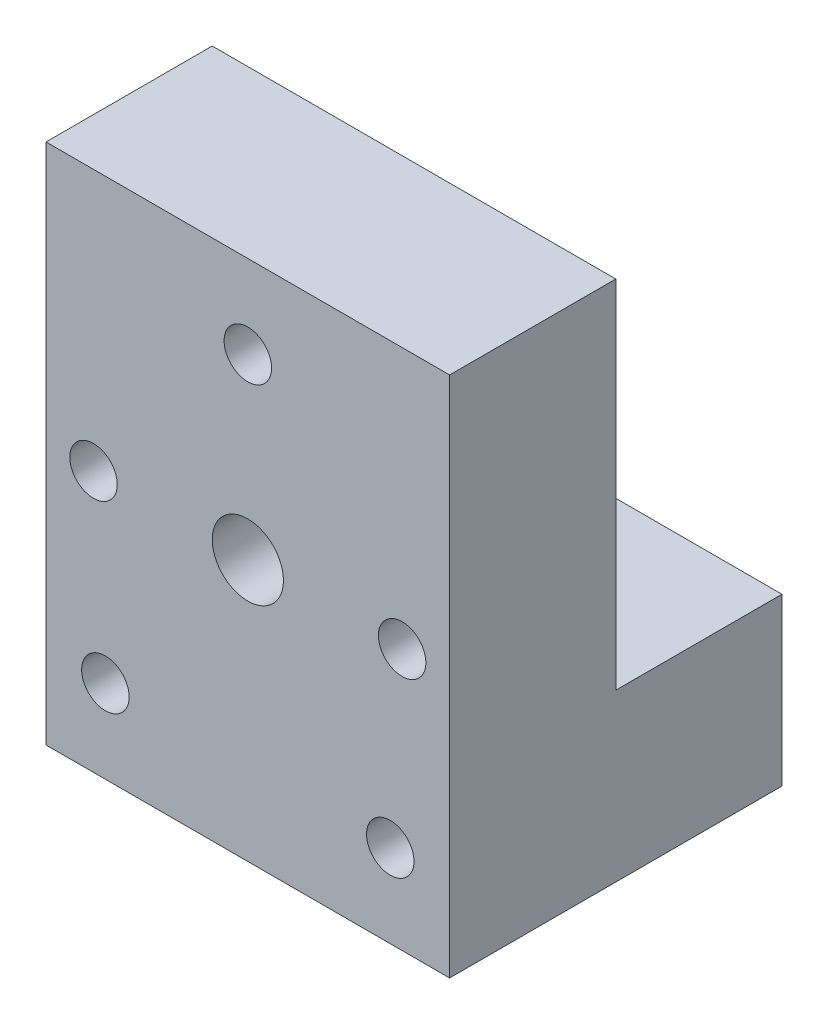
ISO-10303-21;
HEADER;
FILE_DESCRIPTION(('STEP AP214'),'2;1');
FILE_NAME('part.step','',(''),(''),'','','');
FILE_SCHEMA(('AUTOMOTIVE_DESIGN { 1 0 10303 214 1 1 1 1 }'));
ENDSEC;
DATA;
#1=APPLICATION_CONTEXT('core data for automotive mechanical design processes');
#2=APPLICATION_PROTOCOL_DEFINITION('international standard','automotive_design',2000,#1);
#3=PRODUCT_CONTEXT('',#1,'mechanical');
#4=PRODUCT('Part','Part','',(#3));
#5=PRODUCT_RELATED_PRODUCT_CATEGORY('part','',(#4));
#6=PRODUCT_DEFINITION_FORMATION('','',#4);
#7=PRODUCT_DEFINITION_CONTEXT('part definition',#1,'design');
#8=PRODUCT_DEFINITION('design','',#6,#7);
#9=PRODUCT_DEFINITION_SHAPE('','',#8);
#10=(LENGTH_UNIT() NAMED_UNIT(*) SI_UNIT(.MILLI.,.METRE.));
#11=(NAMED_UNIT(*) PLANE_ANGLE_UNIT() SI_UNIT($,.RADIAN.));
#12=(NAMED_UNIT(*) SI_UNIT($,.STERADIAN.) SOLID_ANGLE_UNIT());
#13=UNCERTAINTY_MEASURE_WITH_UNIT(LENGTH_MEASURE(1.E-05),#10,'distance_accuracy_value','');
#14=(GEOMETRIC_REPRESENTATION_CONTEXT(3) GLOBAL_UNCERTAINTY_ASSIGNED_CONTEXT((#13)) GLOBAL_UNIT_ASSIGNED_CONTEXT((#10,
#11,#12)) REPRESENTATION_CONTEXT('',''));
#15=CARTESIAN_POINT('',(0.,0.,0.));
#16=DIRECTION('',(0.,0.,1.));
#17=DIRECTION('',(1.,0.,0.));
#18=AXIS2_PLACEMENT_3D('',#15,#16,#17);
#19=CARTESIAN_POINT('',(0.,0.,0.));
#20=DIRECTION('',(0.,0.,1.));
#21=DIRECTION('',(1.,0.,0.));
#22=AXIS2_PLACEMENT_3D('',#19,#20,#21);
#23=PLANE('',#22);
#24=CARTESIAN_POINT('',(0.,0.,0.));
#25=DIRECTION('',(0.,0.,1.));
#26=DIRECTION('',(1.,0.,0.));
#27=AXIS2_PLACEMENT_3D('',#24,#25,#26);
#28=CIRCLE('',#27,19.05);
#29=CARTESIAN_POINT('',(19.05,0.,0.));
#30=VERTEX_POINT('',#29);
#31=EDGE_CURVE('E242',#30,#30,#28,.F.);
#32=ORIENTED_EDGE('',*,*,#31,.F.);
#33=EDGE_LOOP('',(#32));
#34=FACE_BOUND('',#33,.T.);
#35=CARTESIAN_POINT('',(-82.55,0.,0.));
#36=DIRECTION('',(0.,0.,1.));
#37=DIRECTION('',(1.,0.,0.));
#38=AXIS2_PLACEMENT_3D('',#35,#36,#37);
#39=CIRCLE('',#38,12.7);
#40=CARTESIAN_POINT('',(-69.85,0.,0.));
#41=VERTEX_POINT('',#40);
#42=EDGE_CURVE('E176',#41,#41,#39,.T.);
#43=ORIENTED_EDGE('',*,*,#42,.T.);
#44=EDGE_LOOP('',(#43));
#45=FACE_BOUND('',#44,.T.);
#46=CARTESIAN_POINT('',(82.55,0.,0.));
#47=DIRECTION('',(0.,0.,1.));
#48=DIRECTION('',(1.,0.,0.));
#49=AXIS2_PLACEMENT_3D('',#46,#47,#48);
#50=CIRCLE('',#49,12.7);
#51=CARTESIAN_POINT('',(95.25,0.,0.));
#52=VERTEX_POINT('',#51);
#53=EDGE_CURVE('E158',#52,#52,#50,.T.);
#54=ORIENTED_EDGE('',*,*,#53,.T.);
#55=EDGE_LOOP('',(#54));
#56=FACE_BOUND('',#55,.T.);
#57=DIRECTION('',(1.,0.,0.));
#58=VECTOR('',#57,1.);
#59=CARTESIAN_POINT('',(0.,-50.8,0.));
#60=LINE('',#59,#58);
#61=CARTESIAN_POINT('',(-107.95,-50.8,0.));
#62=VERTEX_POINT('',#61);
#63=CARTESIAN_POINT('',(107.95,-50.8,0.));
#64=VERTEX_POINT('',#63);
#65=EDGE_CURVE('E61',#62,#64,#60,.T.);
#66=ORIENTED_EDGE('',*,*,#65,.F.);
#67=DIRECTION('',(0.,-1.,0.));
#68=VECTOR('',#67,1.);
#69=CARTESIAN_POINT('',(-107.95,0.,0.));
#70=LINE('',#69,#68);
#71=CARTESIAN_POINT('',(-107.95,139.7,0.));
#72=VERTEX_POINT('',#71);
#73=EDGE_CURVE('E165',#72,#62,#70,.T.);
#74=ORIENTED_EDGE('',*,*,#73,.F.);
#75=DIRECTION('',(-1.,0.,0.));
#76=VECTOR('',#75,1.);
#77=CARTESIAN_POINT('',(0.,139.7,0.));
#78=LINE('',#77,#76);
#79=CARTESIAN_POINT('',(107.95,139.7,0.));
#80=VERTEX_POINT('',#79);
#81=EDGE_CURVE('E132',#80,#72,#78,.T.);
#82=ORIENTED_EDGE('',*,*,#81,.F.);
#83=DIRECTION('',(0.,-1.,0.));
#84=VECTOR('',#83,1.);
#85=CARTESIAN_POINT('',(107.95,0.,0.));
#86=LINE('',#85,#84);
#87=EDGE_CURVE('E112',#80,#64,#86,.T.);
#88=ORIENTED_EDGE('',*,*,#87,.T.);
#89=EDGE_LOOP('',(#66,#74,#82,#88));
#90=FACE_BOUND('',#89,.T.);
#91=CARTESIAN_POINT('',(0.,95.25,0.));
#92=DIRECTION('',(0.,0.,1.));
#93=DIRECTION('',(1.,0.,0.));
#94=AXIS2_PLACEMENT_3D('',#91,#92,#93);
#95=CIRCLE('',#94,12.7);
#96=CARTESIAN_POINT('',(12.7,95.25,0.));
#97=VERTEX_POINT('',#96);
#98=EDGE_CURVE('E136',#97,#97,#95,.F.);
#99=ORIENTED_EDGE('',*,*,#98,.F.);
#100=EDGE_LOOP('',(#99));
#101=FACE_BOUND('',#100,.T.);
#102=ADVANCED_FACE('F45',(#34,#45,#56,#90,#101),#23,.F.);
#103=CARTESIAN_POINT('',(107.95,0.,88.9));
#104=DIRECTION('',(1.,0.,0.));
#105=DIRECTION('',(0.,1.,0.));
#106=AXIS2_PLACEMENT_3D('',#103,#104,#105);
#107=PLANE('',#106);
#108=ORIENTED_EDGE('',*,*,#87,.F.);
#109=DIRECTION('',(0.,0.,1.));
#110=VECTOR('',#109,1.);
#111=CARTESIAN_POINT('',(107.95,139.7,-233.486659147798));
#112=LINE('',#111,#110);
#113=CARTESIAN_POINT('',(107.95,139.7,88.9));
#114=VERTEX_POINT('',#113);
#115=EDGE_CURVE('E109',#80,#114,#112,.T.);
#116=ORIENTED_EDGE('',*,*,#115,.T.);
#117=DIRECTION('',(0.,-1.,0.));
#118=VECTOR('',#117,1.);
#119=CARTESIAN_POINT('',(107.95,0.,88.9));
#120=LINE('',#119,#118);
#121=CARTESIAN_POINT('',(107.95,-139.7,88.9));
#122=VERTEX_POINT('',#121);
#123=EDGE_CURVE('E97',#114,#122,#120,.T.);
#124=ORIENTED_EDGE('',*,*,#123,.T.);
#125=DIRECTION('',(0.,0.,-1.));
#126=VECTOR('',#125,1.);
#127=CARTESIAN_POINT('',(107.95,-139.7,88.9));
#128=LINE('',#127,#126);
#129=CARTESIAN_POINT('',(107.95,-139.7,-88.9));
#130=VERTEX_POINT('',#129);
#131=EDGE_CURVE('E54',#122,#130,#128,.T.);
#132=ORIENTED_EDGE('',*,*,#131,.T.);
#133=DIRECTION('',(0.,1.,0.));
#134=VECTOR('',#133,1.);
#135=CARTESIAN_POINT('',(107.95,0.,-88.9));
#136=LINE('',#135,#134);
#137=CARTESIAN_POINT('',(107.95,-50.8,-88.9));
#138=VERTEX_POINT('',#137);
#139=EDGE_CURVE('E141',#130,#138,#136,.T.);
#140=ORIENTED_EDGE('',*,*,#139,.T.);
#141=DIRECTION('',(0.,0.,1.));
#142=VECTOR('',#141,1.);
#143=CARTESIAN_POINT('',(107.95,-50.8,-88.9));
#144=LINE('',#143,#142);
#145=EDGE_CURVE('E151',#138,#64,#144,.T.);
#146=ORIENTED_EDGE('',*,*,#145,.T.);
#147=EDGE_LOOP('',(#108,#116,#124,#132,#140,#146));
#148=FACE_BOUND('',#147,.T.);
#149=ADVANCED_FACE('F110',(#148),#107,.T.);
#150=CARTESIAN_POINT('',(-107.95,0.,88.9));
#151=DIRECTION('',(1.,0.,0.));
#152=DIRECTION('',(0.,1.,0.));
#153=AXIS2_PLACEMENT_3D('',#150,#151,#152);
#154=PLANE('',#153);
#155=ORIENTED_EDGE('',*,*,#73,.T.);
#156=DIRECTION('',(0.,0.,1.));
#157=VECTOR('',#156,1.);
#158=CARTESIAN_POINT('',(-107.95,-50.8,-88.9));
#159=LINE('',#158,#157);
#160=CARTESIAN_POINT('',(-107.95,-50.8,-88.9));
#161=VERTEX_POINT('',#160);
#162=EDGE_CURVE('E154',#161,#62,#159,.T.);
#163=ORIENTED_EDGE('',*,*,#162,.F.);
#164=DIRECTION('',(0.,1.,0.));
#165=VECTOR('',#164,1.);
#166=CARTESIAN_POINT('',(-107.95,0.,-88.9));
#167=LINE('',#166,#165);
#168=CARTESIAN_POINT('',(-107.95,-139.7,-88.9));
#169=VERTEX_POINT('',#168);
#170=EDGE_CURVE('E148',#169,#161,#167,.T.);
#171=ORIENTED_EDGE('',*,*,#170,.F.);
#172=DIRECTION('',(0.,0.,-1.));
#173=VECTOR('',#172,1.);
#174=CARTESIAN_POINT('',(-107.95,-139.7,88.9));
#175=LINE('',#174,#173);
#176=CARTESIAN_POINT('',(-107.95,-139.7,88.9));
#177=VERTEX_POINT('',#176);
#178=EDGE_CURVE('E11',#177,#169,#175,.T.);
#179=ORIENTED_EDGE('',*,*,#178,.F.);
#180=DIRECTION('',(0.,-1.,0.));
#181=VECTOR('',#180,1.);
#182=CARTESIAN_POINT('',(-107.95,0.,88.9));
#183=LINE('',#182,#181);
#184=CARTESIAN_POINT('',(-107.95,139.7,88.9));
#185=VERTEX_POINT('',#184);
#186=EDGE_CURVE('E105',#185,#177,#183,.T.);
#187=ORIENTED_EDGE('',*,*,#186,.F.);
#188=DIRECTION('',(0.,0.,1.));
#189=VECTOR('',#188,1.);
#190=CARTESIAN_POINT('',(-107.95,139.7,-233.486659147798));
#191=LINE('',#190,#189);
#192=EDGE_CURVE('E117',#72,#185,#191,.T.);
#193=ORIENTED_EDGE('',*,*,#192,.F.);
#194=EDGE_LOOP('',(#155,#163,#171,#179,#187,#193));
#195=FACE_BOUND('',#194,.T.);
#196=ADVANCED_FACE('F196',(#195),#154,.F.);
#197=CARTESIAN_POINT('',(-82.55,0.,88.9));
#198=DIRECTION('',(0.,0.,-1.));
#199=DIRECTION('',(-1.,0.,0.));
#200=AXIS2_PLACEMENT_3D('',#197,#198,#199);
#201=CYLINDRICAL_SURFACE('',#200,12.7);
#202=CARTESIAN_POINT('',(-82.55,0.,88.9));
#203=DIRECTION('',(0.,0.,1.));
#204=DIRECTION('',(1.,0.,0.));
#205=AXIS2_PLACEMENT_3D('',#202,#203,#204);
#206=CIRCLE('',#205,12.7);
#207=CARTESIAN_POINT('',(-69.85,0.,88.9));
#208=VERTEX_POINT('',#207);
#209=EDGE_CURVE('E106',#208,#208,#206,.T.);
#210=ORIENTED_EDGE('',*,*,#209,.T.);
#211=EDGE_LOOP('',(#210));
#212=FACE_BOUND('',#211,.T.);
#213=ORIENTED_EDGE('',*,*,#42,.F.);
#214=EDGE_LOOP('',(#213));
#215=FACE_BOUND('',#214,.T.);
#216=ADVANCED_FACE('F224',(#212,#215),#201,.F.);
#217=CARTESIAN_POINT('',(82.55,0.,88.9));
#218=DIRECTION('',(0.,0.,-1.));
#219=DIRECTION('',(-1.,0.,0.));
#220=AXIS2_PLACEMENT_3D('',#217,#218,#219);
#221=CYLINDRICAL_SURFACE('',#220,12.7);
#222=CARTESIAN_POINT('',(82.55,0.,88.9));
#223=DIRECTION('',(0.,0.,1.));
#224=DIRECTION('',(1.,0.,0.));
#225=AXIS2_PLACEMENT_3D('',#222,#223,#224);
#226=CIRCLE('',#225,12.7);
#227=CARTESIAN_POINT('',(95.25,0.,88.9));
#228=VERTEX_POINT('',#227);
#229=EDGE_CURVE('E161',#228,#228,#226,.T.);
#230=ORIENTED_EDGE('',*,*,#229,.T.);
#231=EDGE_LOOP('',(#230));
#232=FACE_BOUND('',#231,.T.);
#233=ORIENTED_EDGE('',*,*,#53,.F.);
#234=EDGE_LOOP('',(#233));
#235=FACE_BOUND('',#234,.T.);
#236=ADVANCED_FACE('F47',(#232,#235),#221,.F.);
#237=CARTESIAN_POINT('',(0.,-139.7,88.9));
#238=DIRECTION('',(0.,1.,0.));
#239=DIRECTION('',(0.,0.,1.));
#240=AXIS2_PLACEMENT_3D('',#237,#238,#239);
#241=PLANE('',#240);
#242=ORIENTED_EDGE('',*,*,#178,.T.);
#243=DIRECTION('',(1.,0.,0.));
#244=VECTOR('',#243,1.);
#245=CARTESIAN_POINT('',(0.,-139.7,-88.9));
#246=LINE('',#245,#244);
#247=EDGE_CURVE('E137',#169,#130,#246,.T.);
#248=ORIENTED_EDGE('',*,*,#247,.T.);
#249=ORIENTED_EDGE('',*,*,#131,.F.);
#250=DIRECTION('',(1.,0.,0.));
#251=VECTOR('',#250,1.);
#252=CARTESIAN_POINT('',(0.,-139.7,88.9));
#253=LINE('',#252,#251);
#254=EDGE_CURVE('E69',#177,#122,#253,.T.);
#255=ORIENTED_EDGE('',*,*,#254,.F.);
#256=EDGE_LOOP('',(#242,#248,#249,#255));
#257=FACE_BOUND('',#256,.T.);
#258=ADVANCED_FACE('F191',(#257),#241,.F.);
#259=CARTESIAN_POINT('',(0.,0.,88.9));
#260=DIRECTION('',(0.,0.,1.));
#261=DIRECTION('',(1.,0.,0.));
#262=AXIS2_PLACEMENT_3D('',#259,#260,#261);
#263=PLANE('',#262);
#264=CARTESIAN_POINT('',(-76.2,-95.25,88.9));
#265=DIRECTION('',(0.,0.,1.));
#266=DIRECTION('',(1.,0.,0.));
#267=AXIS2_PLACEMENT_3D('',#264,#265,#266);
#268=CIRCLE('',#267,12.7);
#269=CARTESIAN_POINT('',(-63.5,-95.25,88.9));
#270=VERTEX_POINT('',#269);
#271=EDGE_CURVE('E255',#270,#270,#268,.T.);
#272=ORIENTED_EDGE('',*,*,#271,.F.);
#273=EDGE_LOOP('',(#272));
#274=FACE_BOUND('',#273,.T.);
#275=CARTESIAN_POINT('',(76.2,-95.25,88.9));
#276=DIRECTION('',(0.,0.,1.));
#277=DIRECTION('',(1.,0.,0.));
#278=AXIS2_PLACEMENT_3D('',#275,#276,#277);
#279=CIRCLE('',#278,12.7);
#280=CARTESIAN_POINT('',(88.9,-95.25,88.9));
#281=VERTEX_POINT('',#280);
#282=EDGE_CURVE('E246',#281,#281,#279,.T.);
#283=ORIENTED_EDGE('',*,*,#282,.F.);
#284=EDGE_LOOP('',(#283));
#285=FACE_BOUND('',#284,.T.);
#286=CARTESIAN_POINT('',(0.,0.,88.9));
#287=DIRECTION('',(0.,0.,1.));
#288=DIRECTION('',(1.,0.,0.));
#289=AXIS2_PLACEMENT_3D('',#286,#287,#288);
#290=CIRCLE('',#289,19.05);
#291=CARTESIAN_POINT('',(19.05,0.,88.9));
#292=VERTEX_POINT('',#291);
#293=EDGE_CURVE('E247',#292,#292,#290,.T.);
#294=ORIENTED_EDGE('',*,*,#293,.F.);
#295=EDGE_LOOP('',(#294));
#296=FACE_BOUND('',#295,.T.);
#297=ORIENTED_EDGE('',*,*,#229,.F.);
#298=EDGE_LOOP('',(#297));
#299=FACE_BOUND('',#298,.T.);
#300=ORIENTED_EDGE('',*,*,#209,.F.);
#301=EDGE_LOOP('',(#300));
#302=FACE_BOUND('',#301,.T.);
#303=ORIENTED_EDGE('',*,*,#123,.F.);
#304=DIRECTION('',(1.,0.,0.));
#305=VECTOR('',#304,1.);
#306=CARTESIAN_POINT('',(0.,139.7,88.9));
#307=LINE('',#306,#305);
#308=EDGE_CURVE('E102',#185,#114,#307,.T.);
#309=ORIENTED_EDGE('',*,*,#308,.F.);
#310=ORIENTED_EDGE('',*,*,#186,.T.);
#311=ORIENTED_EDGE('',*,*,#254,.T.);
#312=EDGE_LOOP('',(#303,#309,#310,#311));
#313=FACE_BOUND('',#312,.T.);
#314=CARTESIAN_POINT('',(0.,95.25,88.9));
#315=DIRECTION('',(0.,0.,1.));
#316=DIRECTION('',(1.,0.,0.));
#317=AXIS2_PLACEMENT_3D('',#314,#315,#316);
#318=CIRCLE('',#317,12.7);
#319=CARTESIAN_POINT('',(12.7,95.25,88.9));
#320=VERTEX_POINT('',#319);
#321=EDGE_CURVE('E123',#320,#320,#318,.T.);
#322=ORIENTED_EDGE('',*,*,#321,.F.);
#323=EDGE_LOOP('',(#322));
#324=FACE_BOUND('',#323,.T.);
#325=ADVANCED_FACE('F99',(#274,#285,#296,#299,#302,#313,#324),#263,.T.);
#326=CARTESIAN_POINT('',(0.,-50.8,-88.9));
#327=DIRECTION('',(0.,-1.,0.));
#328=DIRECTION('',(0.,0.,-1.));
#329=AXIS2_PLACEMENT_3D('',#326,#327,#328);
#330=PLANE('',#329);
#331=ORIENTED_EDGE('',*,*,#65,.T.);
#332=ORIENTED_EDGE('',*,*,#145,.F.);
#333=DIRECTION('',(1.,0.,0.));
#334=VECTOR('',#333,1.);
#335=CARTESIAN_POINT('',(0.,-50.8,-88.9));
#336=LINE('',#335,#334);
#337=EDGE_CURVE('E145',#161,#138,#336,.T.);
#338=ORIENTED_EDGE('',*,*,#337,.F.);
#339=ORIENTED_EDGE('',*,*,#162,.T.);
#340=EDGE_LOOP('',(#331,#332,#338,#339));
#341=FACE_BOUND('',#340,.T.);
#342=ADVANCED_FACE('F198',(#341),#330,.F.);
#343=CARTESIAN_POINT('',(0.,0.,-88.9));
#344=DIRECTION('',(0.,0.,1.));
#345=DIRECTION('',(1.,0.,0.));
#346=AXIS2_PLACEMENT_3D('',#343,#344,#345);
#347=PLANE('',#346);
#348=CARTESIAN_POINT('',(-76.2,-95.25,-88.9));
#349=DIRECTION('',(0.,0.,1.));
#350=DIRECTION('',(1.,0.,0.));
#351=AXIS2_PLACEMENT_3D('',#348,#349,#350);
#352=CIRCLE('',#351,12.7);
#353=CARTESIAN_POINT('',(-63.5,-95.25,-88.9));
#354=VERTEX_POINT('',#353);
#355=EDGE_CURVE('E127',#354,#354,#352,.F.);
#356=ORIENTED_EDGE('',*,*,#355,.F.);
#357=EDGE_LOOP('',(#356));
#358=FACE_BOUND('',#357,.T.);
#359=CARTESIAN_POINT('',(76.2,-95.25,-88.9));
#360=DIRECTION('',(0.,0.,1.));
#361=DIRECTION('',(1.,0.,0.));
#362=AXIS2_PLACEMENT_3D('',#359,#360,#361);
#363=CIRCLE('',#362,12.7);
#364=CARTESIAN_POINT('',(88.9,-95.25,-88.9));
#365=VERTEX_POINT('',#364);
#366=EDGE_CURVE('E251',#365,#365,#363,.F.);
#367=ORIENTED_EDGE('',*,*,#366,.F.);
#368=EDGE_LOOP('',(#367));
#369=FACE_BOUND('',#368,.T.);
#370=ORIENTED_EDGE('',*,*,#247,.F.);
#371=ORIENTED_EDGE('',*,*,#170,.T.);
#372=ORIENTED_EDGE('',*,*,#337,.T.);
#373=ORIENTED_EDGE('',*,*,#139,.F.);
#374=EDGE_LOOP('',(#370,#371,#372,#373));
#375=FACE_BOUND('',#374,.T.);
#376=ADVANCED_FACE('F188',(#358,#369,#375),#347,.F.);
#377=CARTESIAN_POINT('',(0.,95.25,-233.486659147798));
#378=DIRECTION('',(0.,0.,1.));
#379=DIRECTION('',(1.,0.,0.));
#380=AXIS2_PLACEMENT_3D('',#377,#378,#379);
#381=CYLINDRICAL_SURFACE('',#380,12.7);
#382=ORIENTED_EDGE('',*,*,#98,.T.);
#383=EDGE_LOOP('',(#382));
#384=FACE_BOUND('',#383,.T.);
#385=ORIENTED_EDGE('',*,*,#321,.T.);
#386=EDGE_LOOP('',(#385));
#387=FACE_BOUND('',#386,.T.);
#388=ADVANCED_FACE('F206',(#384,#387),#381,.F.);
#389=CARTESIAN_POINT('',(0.,139.7,-233.486659147798));
#390=DIRECTION('',(0.,-1.,0.));
#391=DIRECTION('',(0.,0.,-1.));
#392=AXIS2_PLACEMENT_3D('',#389,#390,#391);
#393=PLANE('',#392);
#394=ORIENTED_EDGE('',*,*,#115,.F.);
#395=ORIENTED_EDGE('',*,*,#81,.T.);
#396=ORIENTED_EDGE('',*,*,#192,.T.);
#397=ORIENTED_EDGE('',*,*,#308,.T.);
#398=EDGE_LOOP('',(#394,#395,#396,#397));
#399=FACE_BOUND('',#398,.T.);
#400=ADVANCED_FACE('F120',(#399),#393,.F.);
#401=CARTESIAN_POINT('',(76.2,-95.25,-88.901));
#402=DIRECTION('',(0.,0.,1.));
#403=DIRECTION('',(1.,0.,0.));
#404=AXIS2_PLACEMENT_3D('',#401,#402,#403);
#405=CYLINDRICAL_SURFACE('',#404,12.7);
#406=ORIENTED_EDGE('',*,*,#282,.T.);
#407=EDGE_LOOP('',(#406));
#408=FACE_BOUND('',#407,.T.);
#409=ORIENTED_EDGE('',*,*,#366,.T.);
#410=EDGE_LOOP('',(#409));
#411=FACE_BOUND('',#410,.T.);
#412=ADVANCED_FACE('F284',(#408,#411),#405,.F.);
#413=CARTESIAN_POINT('',(-76.2,-95.25,-88.901));
#414=DIRECTION('',(0.,0.,1.));
#415=DIRECTION('',(1.,0.,0.));
#416=AXIS2_PLACEMENT_3D('',#413,#414,#415);
#417=CYLINDRICAL_SURFACE('',#416,12.7);
#418=ORIENTED_EDGE('',*,*,#271,.T.);
#419=EDGE_LOOP('',(#418));
#420=FACE_BOUND('',#419,.T.);
#421=ORIENTED_EDGE('',*,*,#355,.T.);
#422=EDGE_LOOP('',(#421));
#423=FACE_BOUND('',#422,.T.);
#424=ADVANCED_FACE('F266',(#420,#423),#417,.F.);
#425=CARTESIAN_POINT('',(0.,0.,-88.901));
#426=DIRECTION('',(0.,0.,1.));
#427=DIRECTION('',(1.,0.,0.));
#428=AXIS2_PLACEMENT_3D('',#425,#426,#427);
#429=CYLINDRICAL_SURFACE('',#428,19.05);
#430=ORIENTED_EDGE('',*,*,#293,.T.);
#431=EDGE_LOOP('',(#430));
#432=FACE_BOUND('',#431,.T.);
#433=ORIENTED_EDGE('',*,*,#31,.T.);
#434=EDGE_LOOP('',(#433));
#435=FACE_BOUND('',#434,.T.);
#436=ADVANCED_FACE('F277',(#432,#435),#429,.F.);
#437=CLOSED_SHELL('',(#102,#149,#196,#216,#236,#258,#325,#342,#376,#388,#400,#412,#424,#436));
#438=MANIFOLD_SOLID_BREP('B2',#437);
#439=ADVANCED_BREP_SHAPE_REPRESENTATION('',(#18,#438),#14);
#440=SHAPE_DEFINITION_REPRESENTATION(#9,#439);
ENDSEC;
END-ISO-10303-21;
